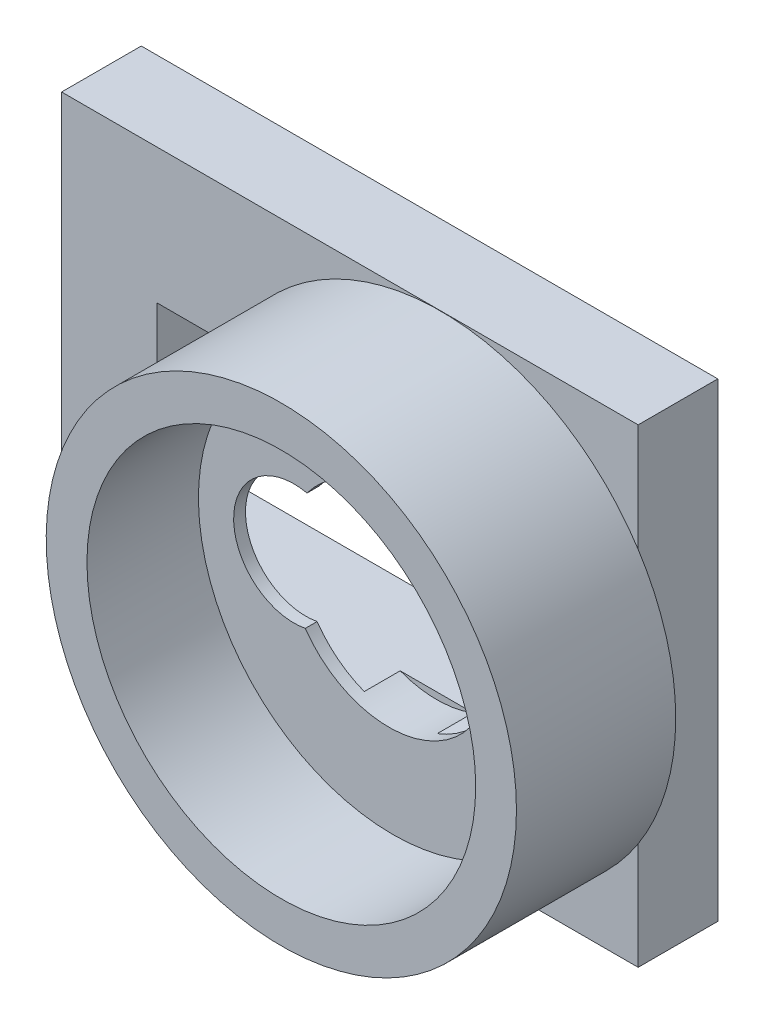
ISO-10303-21;
HEADER;
FILE_DESCRIPTION(('STEP AP214'),'2;1');
FILE_NAME('part.step','',(''),(''),'','','');
FILE_SCHEMA(('AUTOMOTIVE_DESIGN { 1 0 10303 214 1 1 1 1 }'));
ENDSEC;
DATA;
#1=APPLICATION_CONTEXT('core data for automotive mechanical design processes');
#2=APPLICATION_PROTOCOL_DEFINITION('international standard','automotive_design',2000,#1);
#3=PRODUCT_CONTEXT('',#1,'mechanical');
#4=PRODUCT('Part','Part','',(#3));
#5=PRODUCT_RELATED_PRODUCT_CATEGORY('part','',(#4));
#6=PRODUCT_DEFINITION_FORMATION('','',#4);
#7=PRODUCT_DEFINITION_CONTEXT('part definition',#1,'design');
#8=PRODUCT_DEFINITION('design','',#6,#7);
#9=PRODUCT_DEFINITION_SHAPE('','',#8);
#10=(LENGTH_UNIT() NAMED_UNIT(*) SI_UNIT(.MILLI.,.METRE.));
#11=(NAMED_UNIT(*) PLANE_ANGLE_UNIT() SI_UNIT($,.RADIAN.));
#12=(NAMED_UNIT(*) SI_UNIT($,.STERADIAN.) SOLID_ANGLE_UNIT());
#13=UNCERTAINTY_MEASURE_WITH_UNIT(LENGTH_MEASURE(1.E-05),#10,'distance_accuracy_value','');
#14=(GEOMETRIC_REPRESENTATION_CONTEXT(3) GLOBAL_UNCERTAINTY_ASSIGNED_CONTEXT((#13)) GLOBAL_UNIT_ASSIGNED_CONTEXT((#10,
#11,#12)) REPRESENTATION_CONTEXT('',''));
#15=CARTESIAN_POINT('',(0.,0.,0.));
#16=DIRECTION('',(0.,0.,1.));
#17=DIRECTION('',(1.,0.,0.));
#18=AXIS2_PLACEMENT_3D('',#15,#16,#17);
#19=CARTESIAN_POINT('',(0.,0.,5.));
#20=DIRECTION('',(0.,0.,1.));
#21=DIRECTION('',(1.,0.,0.));
#22=AXIS2_PLACEMENT_3D('',#19,#20,#21);
#23=PLANE('',#22);
#24=DIRECTION('',(1.,0.,0.));
#25=VECTOR('',#24,1.);
#26=CARTESIAN_POINT('',(21.0499987006187,-21.3449988514185,5.));
#27=LINE('',#26,#25);
#28=CARTESIAN_POINT('',(8.25926228249251,-21.3449988514185,4.99999988824129));
#29=VERTEX_POINT('',#28);
#30=CARTESIAN_POINT('',(12.8376101178694,-21.3449988514185,4.99999988824129));
#31=VERTEX_POINT('',#30);
#32=EDGE_CURVE('E302',#29,#31,#27,.T.);
#33=ORIENTED_EDGE('',*,*,#32,.F.);
#34=CARTESIAN_POINT('',(10.5484362001809,-15.3881239401325,5.));
#35=DIRECTION('',(0.,0.,1.));
#36=DIRECTION('',(1.,0.,0.));
#37=AXIS2_PLACEMENT_3D('',#34,#35,#36);
#38=CIRCLE('',#37,6.38158882521694);
#39=EDGE_CURVE('E252',#29,#31,#38,.T.);
#40=ORIENTED_EDGE('',*,*,#39,.T.);
#41=EDGE_LOOP('',(#33,#40));
#42=FACE_BOUND('',#41,.T.);
#43=ADVANCED_FACE('F41',(#42),#23,.T.);
#44=DIRECTION('',(0.,-1.,0.));
#45=VECTOR('',#44,1.);
#46=CARTESIAN_POINT('',(16.4916390715284,-8.97299963980913,5.));
#47=LINE('',#46,#45);
#48=CARTESIAN_POINT('',(16.4916390715284,-13.0636851768735,5.));
#49=VERTEX_POINT('',#48);
#50=CARTESIAN_POINT('',(16.4916390715284,-17.7125627033915,4.99999988824129));
#51=VERTEX_POINT('',#50);
#52=EDGE_CURVE('E289',#49,#51,#47,.T.);
#53=ORIENTED_EDGE('',*,*,#52,.T.);
#54=EDGE_CURVE('E249',#51,#49,#38,.T.);
#55=ORIENTED_EDGE('',*,*,#54,.T.);
#56=EDGE_LOOP('',(#53,#55));
#57=FACE_BOUND('',#56,.T.);
#58=ADVANCED_FACE('F390',(#57),#23,.T.);
#59=CARTESIAN_POINT('',(-7.00300000607967,-21.3449988514185,5.));
#60=VERTEX_POINT('',#59);
#61=CARTESIAN_POINT('',(-2.66384226985813,-21.3449988514185,4.99999988824129));
#62=VERTEX_POINT('',#61);
#63=EDGE_CURVE('E304',#60,#62,#27,.T.);
#64=ORIENTED_EDGE('',*,*,#63,.F.);
#65=DIRECTION('',(0.,1.,0.));
#66=VECTOR('',#65,1.);
#67=CARTESIAN_POINT('',(-7.00300000607967,-8.97299963980913,5.));
#68=LINE('',#67,#66);
#69=CARTESIAN_POINT('',(-7.00300000607967,-8.97299963980913,5.));
#70=VERTEX_POINT('',#69);
#71=EDGE_CURVE('E272',#60,#70,#68,.T.);
#72=ORIENTED_EDGE('',*,*,#71,.T.);
#73=DIRECTION('',(-1.,0.,0.));
#74=VECTOR('',#73,1.);
#75=CARTESIAN_POINT('',(21.0499987006187,-8.97299963980913,5.));
#76=LINE('',#75,#74);
#77=CARTESIAN_POINT('',(-2.55601900280958,-8.97299963980913,4.99999988824129));
#78=VERTEX_POINT('',#77);
#79=EDGE_CURVE('E300',#78,#70,#76,.T.);
#80=ORIENTED_EDGE('',*,*,#79,.F.);
#81=CARTESIAN_POINT('',(10.7946453661089,-15.275821527386,5.));
#82=DIRECTION('',(0.,0.,1.));
#83=DIRECTION('',(1.,0.,0.));
#84=AXIS2_PLACEMENT_3D('',#81,#82,#83);
#85=CIRCLE('',#84,14.7636649527828);
#86=CARTESIAN_POINT('',(23.2000015676022,-7.27126405354031,5.));
#87=VERTEX_POINT('',#86);
#88=EDGE_CURVE('E273',#87,#78,#85,.T.);
#89=ORIENTED_EDGE('',*,*,#88,.F.);
#90=DIRECTION('',(0.,1.,0.));
#91=VECTOR('',#90,1.);
#92=CARTESIAN_POINT('',(23.2000015676022,-0.500000023748725,5.));
#93=LINE('',#92,#91);
#94=CARTESIAN_POINT('',(23.2000015676022,-0.500000023748725,5.));
#95=VERTEX_POINT('',#94);
#96=EDGE_CURVE('E333',#87,#95,#93,.T.);
#97=ORIENTED_EDGE('',*,*,#96,.T.);
#98=DIRECTION('',(-1.,0.,0.));
#99=VECTOR('',#98,1.);
#100=CARTESIAN_POINT('',(-13.0000002682209,-0.500000023748725,5.));
#101=LINE('',#100,#99);
#102=CARTESIAN_POINT('',(-13.0000002682209,-0.500000023748725,5.));
#103=VERTEX_POINT('',#102);
#104=EDGE_CURVE('E338',#95,#103,#101,.T.);
#105=ORIENTED_EDGE('',*,*,#104,.T.);
#106=DIRECTION('',(0.,-1.,0.));
#107=VECTOR('',#106,1.);
#108=CARTESIAN_POINT('',(-13.0000002682209,-0.500000023748725,5.));
#109=LINE('',#108,#107);
#110=CARTESIAN_POINT('',(-13.0000002682209,-29.9999993294477,5.));
#111=VERTEX_POINT('',#110);
#112=EDGE_CURVE('E326',#103,#111,#109,.T.);
#113=ORIENTED_EDGE('',*,*,#112,.T.);
#114=DIRECTION('',(1.,0.,0.));
#115=VECTOR('',#114,1.);
#116=CARTESIAN_POINT('',(-13.0000002682209,-29.9999993294477,5.));
#117=LINE('',#116,#115);
#118=CARTESIAN_POINT('',(9.715575909911,-29.9999993294477,5.));
#119=VERTEX_POINT('',#118);
#120=EDGE_CURVE('E330',#111,#119,#117,.T.);
#121=ORIENTED_EDGE('',*,*,#120,.T.);
#122=EDGE_CURVE('E366',#62,#119,#85,.T.);
#123=ORIENTED_EDGE('',*,*,#122,.F.);
#124=EDGE_LOOP('',(#64,#72,#80,#89,#97,#105,#113,#121,#123));
#125=FACE_BOUND('',#124,.T.);
#126=ADVANCED_FACE('F392',(#125),#23,.T.);
#127=CARTESIAN_POINT('',(10.5484362001809,-15.3881239401325,5.));
#128=DIRECTION('',(0.,0.,1.));
#129=DIRECTION('',(1.,0.,0.));
#130=AXIS2_PLACEMENT_3D('',#127,#128,#129);
#131=CIRCLE('',#130,12.3981391852221);
#132=CARTESIAN_POINT('',(22.2653650239285,-19.4412010668812,5.));
#133=VERTEX_POINT('',#132);
#134=CARTESIAN_POINT('',(15.1689220287418,-3.88312650579079,5.));
#135=VERTEX_POINT('',#134);
#136=EDGE_CURVE('E255',#133,#135,#131,.T.);
#137=ORIENTED_EDGE('',*,*,#136,.F.);
#138=CARTESIAN_POINT('',(10.7946453661089,-15.275821527386,5.));
#139=DIRECTION('',(0.,0.,1.));
#140=DIRECTION('',(1.,0.,0.));
#141=AXIS2_PLACEMENT_3D('',#138,#139,#140);
#142=CIRCLE('',#141,12.2035976734869);
#143=EDGE_CURVE('E264',#133,#135,#142,.T.);
#144=ORIENTED_EDGE('',*,*,#143,.T.);
#145=EDGE_LOOP('',(#137,#144));
#146=FACE_BOUND('',#145,.T.);
#147=ADVANCED_FACE('F398',(#146),#23,.T.);
#148=CARTESIAN_POINT('',(-12.002999894321,-8.97299963980913,5.));
#149=DIRECTION('',(1.,0.,0.));
#150=DIRECTION('',(0.,0.,-1.));
#151=AXIS2_PLACEMENT_3D('',#148,#149,#150);
#152=PLANE('',#151);
#153=DIRECTION('',(0.,0.,-1.));
#154=VECTOR('',#153,1.);
#155=CARTESIAN_POINT('',(-12.002999894321,-8.97299963980913,5.));
#156=LINE('',#155,#154);
#157=CARTESIAN_POINT('',(-12.002999894321,-8.97299963980913,1.5));
#158=VERTEX_POINT('',#157);
#159=CARTESIAN_POINT('',(-12.002999894321,-8.97299963980913,0.));
#160=VERTEX_POINT('',#159);
#161=EDGE_CURVE('E321',#158,#160,#156,.T.);
#162=ORIENTED_EDGE('',*,*,#161,.F.);
#163=DIRECTION('',(0.,-1.,0.));
#164=VECTOR('',#163,1.);
#165=CARTESIAN_POINT('',(-12.002999894321,-8.97299963980913,1.5));
#166=LINE('',#165,#164);
#167=CARTESIAN_POINT('',(-12.002999894321,-21.3449988514185,1.5));
#168=VERTEX_POINT('',#167);
#169=EDGE_CURVE('E277',#158,#168,#166,.T.);
#170=ORIENTED_EDGE('',*,*,#169,.T.);
#171=DIRECTION('',(0.,0.,-1.));
#172=VECTOR('',#171,1.);
#173=CARTESIAN_POINT('',(-12.002999894321,-21.3449988514185,5.));
#174=LINE('',#173,#172);
#175=CARTESIAN_POINT('',(-12.002999894321,-21.3449988514185,0.));
#176=VERTEX_POINT('',#175);
#177=EDGE_CURVE('E319',#168,#176,#174,.T.);
#178=ORIENTED_EDGE('',*,*,#177,.T.);
#179=DIRECTION('',(0.,-1.,0.));
#180=VECTOR('',#179,1.);
#181=CARTESIAN_POINT('',(-12.002999894321,-8.97299963980913,0.));
#182=LINE('',#181,#180);
#183=EDGE_CURVE('E313',#160,#176,#182,.T.);
#184=ORIENTED_EDGE('',*,*,#183,.F.);
#185=EDGE_LOOP('',(#162,#170,#178,#184));
#186=FACE_BOUND('',#185,.T.);
#187=ADVANCED_FACE('F406',(#186),#152,.T.);
#188=CARTESIAN_POINT('',(11.8737148223067,-29.9999993294477,5.));
#189=VERTEX_POINT('',#188);
#190=CARTESIAN_POINT('',(23.2000015676022,-23.2803790012317,5.));
#191=VERTEX_POINT('',#190);
#192=EDGE_CURVE('E267',#189,#191,#85,.T.);
#193=ORIENTED_EDGE('',*,*,#192,.F.);
#194=CARTESIAN_POINT('',(23.2000015676022,-29.9999993294477,5.));
#195=VERTEX_POINT('',#194);
#196=EDGE_CURVE('E328',#189,#195,#117,.T.);
#197=ORIENTED_EDGE('',*,*,#196,.T.);
#198=EDGE_CURVE('E335',#195,#191,#93,.T.);
#199=ORIENTED_EDGE('',*,*,#198,.T.);
#200=EDGE_LOOP('',(#193,#197,#199));
#201=FACE_BOUND('',#200,.T.);
#202=ADVANCED_FACE('F401',(#201),#23,.T.);
#203=CARTESIAN_POINT('',(0.,0.,0.));
#204=DIRECTION('',(0.,0.,1.));
#205=DIRECTION('',(1.,0.,0.));
#206=AXIS2_PLACEMENT_3D('',#203,#204,#205);
#207=PLANE('',#206);
#208=DIRECTION('',(0.,-1.,0.));
#209=VECTOR('',#208,1.);
#210=CARTESIAN_POINT('',(-13.0000002682209,-0.500000023748725,0.));
#211=LINE('',#210,#209);
#212=CARTESIAN_POINT('',(-13.0000002682209,-0.500000023748725,0.));
#213=VERTEX_POINT('',#212);
#214=CARTESIAN_POINT('',(-13.0000002682209,-29.9999993294477,0.));
#215=VERTEX_POINT('',#214);
#216=EDGE_CURVE('E325',#213,#215,#211,.T.);
#217=ORIENTED_EDGE('',*,*,#216,.F.);
#218=DIRECTION('',(-1.,0.,0.));
#219=VECTOR('',#218,1.);
#220=CARTESIAN_POINT('',(-13.0000002682209,-0.500000023748725,0.));
#221=LINE('',#220,#219);
#222=CARTESIAN_POINT('',(23.2000015676022,-0.500000023748725,0.));
#223=VERTEX_POINT('',#222);
#224=EDGE_CURVE('E329',#223,#213,#221,.T.);
#225=ORIENTED_EDGE('',*,*,#224,.F.);
#226=DIRECTION('',(0.,1.,0.));
#227=VECTOR('',#226,1.);
#228=CARTESIAN_POINT('',(23.2000015676022,-0.500000023748725,0.));
#229=LINE('',#228,#227);
#230=CARTESIAN_POINT('',(23.2000015676022,-29.9999993294477,0.));
#231=VERTEX_POINT('',#230);
#232=EDGE_CURVE('E346',#231,#223,#229,.T.);
#233=ORIENTED_EDGE('',*,*,#232,.F.);
#234=DIRECTION('',(1.,0.,0.));
#235=VECTOR('',#234,1.);
#236=CARTESIAN_POINT('',(-13.0000002682209,-29.9999993294477,0.));
#237=LINE('',#236,#235);
#238=EDGE_CURVE('E344',#215,#231,#237,.T.);
#239=ORIENTED_EDGE('',*,*,#238,.F.);
#240=EDGE_LOOP('',(#217,#225,#233,#239));
#241=FACE_BOUND('',#240,.T.);
#242=DIRECTION('',(0.,1.,0.));
#243=VECTOR('',#242,1.);
#244=CARTESIAN_POINT('',(21.0499987006187,-8.97299963980913,0.));
#245=LINE('',#244,#243);
#246=CARTESIAN_POINT('',(21.0499987006187,-21.3449988514185,0.));
#247=VERTEX_POINT('',#246);
#248=CARTESIAN_POINT('',(21.0499987006187,-8.97299963980913,0.));
#249=VERTEX_POINT('',#248);
#250=EDGE_CURVE('E209',#247,#249,#245,.T.);
#251=ORIENTED_EDGE('',*,*,#250,.T.);
#252=DIRECTION('',(-1.,0.,0.));
#253=VECTOR('',#252,1.);
#254=CARTESIAN_POINT('',(21.0499987006187,-8.97299963980913,0.));
#255=LINE('',#254,#253);
#256=EDGE_CURVE('E310',#249,#160,#255,.T.);
#257=ORIENTED_EDGE('',*,*,#256,.T.);
#258=ORIENTED_EDGE('',*,*,#183,.T.);
#259=DIRECTION('',(1.,0.,0.));
#260=VECTOR('',#259,1.);
#261=CARTESIAN_POINT('',(21.0499987006187,-21.3449988514185,0.));
#262=LINE('',#261,#260);
#263=EDGE_CURVE('E303',#176,#247,#262,.T.);
#264=ORIENTED_EDGE('',*,*,#263,.T.);
#265=EDGE_LOOP('',(#251,#257,#258,#264));
#266=FACE_BOUND('',#265,.T.);
#267=ADVANCED_FACE('F405',(#241,#266),#207,.F.);
#268=CARTESIAN_POINT('',(-13.0000002682209,-0.500000023748725,5.));
#269=DIRECTION('',(1.,0.,0.));
#270=DIRECTION('',(0.,0.,-1.));
#271=AXIS2_PLACEMENT_3D('',#268,#269,#270);
#272=PLANE('',#271);
#273=ORIENTED_EDGE('',*,*,#216,.T.);
#274=DIRECTION('',(0.,0.,-1.));
#275=VECTOR('',#274,1.);
#276=CARTESIAN_POINT('',(-13.0000002682209,-29.9999993294477,5.));
#277=LINE('',#276,#275);
#278=EDGE_CURVE('E357',#111,#215,#277,.T.);
#279=ORIENTED_EDGE('',*,*,#278,.F.);
#280=ORIENTED_EDGE('',*,*,#112,.F.);
#281=DIRECTION('',(0.,0.,-1.));
#282=VECTOR('',#281,1.);
#283=CARTESIAN_POINT('',(-13.0000002682209,-0.500000023748725,5.));
#284=LINE('',#283,#282);
#285=EDGE_CURVE('E341',#103,#213,#284,.T.);
#286=ORIENTED_EDGE('',*,*,#285,.T.);
#287=EDGE_LOOP('',(#273,#279,#280,#286));
#288=FACE_BOUND('',#287,.T.);
#289=ADVANCED_FACE('F43',(#288),#272,.F.);
#290=CARTESIAN_POINT('',(-13.0000002682209,-29.9999993294477,5.));
#291=DIRECTION('',(0.,1.,0.));
#292=DIRECTION('',(0.,0.,1.));
#293=AXIS2_PLACEMENT_3D('',#290,#291,#292);
#294=PLANE('',#293);
#295=ORIENTED_EDGE('',*,*,#238,.T.);
#296=DIRECTION('',(0.,0.,-1.));
#297=VECTOR('',#296,1.);
#298=CARTESIAN_POINT('',(23.2000015676022,-29.9999993294477,5.));
#299=LINE('',#298,#297);
#300=EDGE_CURVE('E354',#195,#231,#299,.T.);
#301=ORIENTED_EDGE('',*,*,#300,.F.);
#302=ORIENTED_EDGE('',*,*,#196,.F.);
#303=EDGE_CURVE('E334',#119,#189,#117,.T.);
#304=ORIENTED_EDGE('',*,*,#303,.F.);
#305=ORIENTED_EDGE('',*,*,#120,.F.);
#306=ORIENTED_EDGE('',*,*,#278,.T.);
#307=EDGE_LOOP('',(#295,#301,#302,#304,#305,#306));
#308=FACE_BOUND('',#307,.T.);
#309=ADVANCED_FACE('F419',(#308),#294,.F.);
#310=CARTESIAN_POINT('',(23.2000015676022,-0.500000023748725,5.));
#311=DIRECTION('',(-1.,0.,0.));
#312=DIRECTION('',(0.,0.,1.));
#313=AXIS2_PLACEMENT_3D('',#310,#311,#312);
#314=PLANE('',#313);
#315=ORIENTED_EDGE('',*,*,#232,.T.);
#316=DIRECTION('',(0.,0.,-1.));
#317=VECTOR('',#316,1.);
#318=CARTESIAN_POINT('',(23.2000015676022,-0.500000023748725,5.));
#319=LINE('',#318,#317);
#320=EDGE_CURVE('E351',#95,#223,#319,.T.);
#321=ORIENTED_EDGE('',*,*,#320,.F.);
#322=ORIENTED_EDGE('',*,*,#96,.F.);
#323=EDGE_CURVE('E339',#191,#87,#93,.T.);
#324=ORIENTED_EDGE('',*,*,#323,.F.);
#325=ORIENTED_EDGE('',*,*,#198,.F.);
#326=ORIENTED_EDGE('',*,*,#300,.T.);
#327=EDGE_LOOP('',(#315,#321,#322,#324,#325,#326));
#328=FACE_BOUND('',#327,.T.);
#329=ADVANCED_FACE('F416',(#328),#314,.F.);
#330=CARTESIAN_POINT('',(-13.0000002682209,-0.500000023748725,5.));
#331=DIRECTION('',(0.,-1.,0.));
#332=DIRECTION('',(0.,0.,-1.));
#333=AXIS2_PLACEMENT_3D('',#330,#331,#332);
#334=PLANE('',#333);
#335=ORIENTED_EDGE('',*,*,#224,.T.);
#336=ORIENTED_EDGE('',*,*,#285,.F.);
#337=ORIENTED_EDGE('',*,*,#104,.F.);
#338=ORIENTED_EDGE('',*,*,#320,.T.);
#339=EDGE_LOOP('',(#335,#336,#337,#338));
#340=FACE_BOUND('',#339,.T.);
#341=ADVANCED_FACE('F413',(#340),#334,.F.);
#342=CARTESIAN_POINT('',(21.0499987006187,-8.97299963980913,5.));
#343=DIRECTION('',(-1.,0.,0.));
#344=DIRECTION('',(0.,0.,1.));
#345=AXIS2_PLACEMENT_3D('',#342,#343,#344);
#346=PLANE('',#345);
#347=DIRECTION('',(0.,1.,0.));
#348=VECTOR('',#347,1.);
#349=CARTESIAN_POINT('',(21.0499987006187,-8.97299963980913,1.5));
#350=LINE('',#349,#348);
#351=CARTESIAN_POINT('',(21.0499987006187,-21.3449988514185,1.5));
#352=VERTEX_POINT('',#351);
#353=CARTESIAN_POINT('',(21.0499987006187,-8.97299963980913,1.5));
#354=VERTEX_POINT('',#353);
#355=EDGE_CURVE('E290',#352,#354,#350,.T.);
#356=ORIENTED_EDGE('',*,*,#355,.T.);
#357=DIRECTION('',(0.,0.,-1.));
#358=VECTOR('',#357,1.);
#359=CARTESIAN_POINT('',(21.0499987006187,-8.97299963980913,5.));
#360=LINE('',#359,#358);
#361=EDGE_CURVE('E323',#354,#249,#360,.T.);
#362=ORIENTED_EDGE('',*,*,#361,.T.);
#363=ORIENTED_EDGE('',*,*,#250,.F.);
#364=DIRECTION('',(0.,0.,-1.));
#365=VECTOR('',#364,1.);
#366=CARTESIAN_POINT('',(21.0499987006187,-21.3449988514185,5.));
#367=LINE('',#366,#365);
#368=EDGE_CURVE('E307',#352,#247,#367,.T.);
#369=ORIENTED_EDGE('',*,*,#368,.F.);
#370=EDGE_LOOP('',(#356,#362,#363,#369));
#371=FACE_BOUND('',#370,.T.);
#372=ADVANCED_FACE('F408',(#371),#346,.T.);
#373=CARTESIAN_POINT('',(21.0499987006187,-8.97299963980913,5.));
#374=DIRECTION('',(0.,-1.,0.));
#375=DIRECTION('',(0.,0.,-1.));
#376=AXIS2_PLACEMENT_3D('',#373,#374,#375);
#377=PLANE('',#376);
#378=DIRECTION('',(0.,0.,1.));
#379=VECTOR('',#378,1.);
#380=CARTESIAN_POINT('',(-7.00300000607967,-8.97299963980913,1.5));
#381=LINE('',#380,#379);
#382=CARTESIAN_POINT('',(-7.00300000607967,-8.97299963980913,1.5));
#383=VERTEX_POINT('',#382);
#384=EDGE_CURVE('E284',#383,#70,#381,.T.);
#385=ORIENTED_EDGE('',*,*,#384,.F.);
#386=DIRECTION('',(-1.,0.,0.));
#387=VECTOR('',#386,1.);
#388=CARTESIAN_POINT('',(-12.002999894321,-8.97299963980913,1.5));
#389=LINE('',#388,#387);
#390=EDGE_CURVE('E282',#383,#158,#389,.T.);
#391=ORIENTED_EDGE('',*,*,#390,.T.);
#392=ORIENTED_EDGE('',*,*,#161,.T.);
#393=ORIENTED_EDGE('',*,*,#256,.F.);
#394=ORIENTED_EDGE('',*,*,#361,.F.);
#395=DIRECTION('',(-1.,0.,0.));
#396=VECTOR('',#395,1.);
#397=CARTESIAN_POINT('',(21.0499987006187,-8.97299963980913,1.5));
#398=LINE('',#397,#396);
#399=CARTESIAN_POINT('',(16.4916390715284,-8.97299963980913,1.5));
#400=VERTEX_POINT('',#399);
#401=EDGE_CURVE('E292',#354,#400,#398,.T.);
#402=ORIENTED_EDGE('',*,*,#401,.T.);
#403=DIRECTION('',(0.,0.,1.));
#404=VECTOR('',#403,1.);
#405=CARTESIAN_POINT('',(16.4916390715284,-8.97299963980913,1.5));
#406=LINE('',#405,#404);
#407=CARTESIAN_POINT('',(16.4916390715284,-8.97299963980913,7.25651338028399));
#408=VERTEX_POINT('',#407);
#409=EDGE_CURVE('E210',#400,#408,#406,.T.);
#410=ORIENTED_EDGE('',*,*,#409,.T.);
#411=DIRECTION('',(-1.,0.,0.));
#412=VECTOR('',#411,1.);
#413=CARTESIAN_POINT('',(29.0677361462107,-8.97299963980913,7.25651338028399));
#414=LINE('',#413,#412);
#415=CARTESIAN_POINT('',(-2.55601900280959,-8.97299963980913,7.25651338028399));
#416=VERTEX_POINT('',#415);
#417=EDGE_CURVE('E220',#408,#416,#414,.T.);
#418=ORIENTED_EDGE('',*,*,#417,.T.);
#419=DIRECTION('',(0.,0.,-1.));
#420=VECTOR('',#419,1.);
#421=CARTESIAN_POINT('',(-2.55601900280959,-8.97299963980913,15.));
#422=LINE('',#421,#420);
#423=EDGE_CURVE('E11',#78,#416,#422,.F.);
#424=ORIENTED_EDGE('',*,*,#423,.F.);
#425=ORIENTED_EDGE('',*,*,#79,.T.);
#426=EDGE_LOOP('',(#385,#391,#392,#393,#394,#402,#410,#418,#424,#425));
#427=FACE_BOUND('',#426,.T.);
#428=ADVANCED_FACE('F488',(#427),#377,.T.);
#429=CARTESIAN_POINT('',(21.0499987006187,-21.3449988514185,5.));
#430=DIRECTION('',(0.,1.,0.));
#431=DIRECTION('',(0.,0.,1.));
#432=AXIS2_PLACEMENT_3D('',#429,#430,#431);
#433=PLANE('',#432);
#434=DIRECTION('',(0.,0.,-1.));
#435=VECTOR('',#434,1.);
#436=CARTESIAN_POINT('',(-7.00300000607967,-21.3449988514185,5.));
#437=LINE('',#436,#435);
#438=CARTESIAN_POINT('',(-7.00300000607967,-21.3449988514185,1.5));
#439=VERTEX_POINT('',#438);
#440=EDGE_CURVE('E268',#60,#439,#437,.T.);
#441=ORIENTED_EDGE('',*,*,#440,.F.);
#442=ORIENTED_EDGE('',*,*,#63,.T.);
#443=DIRECTION('',(0.,0.,-1.));
#444=VECTOR('',#443,1.);
#445=CARTESIAN_POINT('',(-2.66384226985814,-21.3449988514185,15.));
#446=LINE('',#445,#444);
#447=CARTESIAN_POINT('',(-2.66384226985813,-21.3449988514185,7.25651338028399));
#448=VERTEX_POINT('',#447);
#449=EDGE_CURVE('E232',#448,#62,#446,.T.);
#450=ORIENTED_EDGE('',*,*,#449,.F.);
#451=DIRECTION('',(-1.,0.,0.));
#452=VECTOR('',#451,1.);
#453=CARTESIAN_POINT('',(29.0677361462107,-21.3449988514185,7.25651338028399));
#454=LINE('',#453,#452);
#455=CARTESIAN_POINT('',(8.25926228249251,-21.3449988514185,7.25651338028399));
#456=VERTEX_POINT('',#455);
#457=EDGE_CURVE('E226',#456,#448,#454,.T.);
#458=ORIENTED_EDGE('',*,*,#457,.F.);
#459=DIRECTION('',(0.,0.,1.));
#460=VECTOR('',#459,1.);
#461=CARTESIAN_POINT('',(8.2592622824925,-21.3449988514185,5.));
#462=LINE('',#461,#460);
#463=EDGE_CURVE('E378',#29,#456,#462,.T.);
#464=ORIENTED_EDGE('',*,*,#463,.F.);
#465=ORIENTED_EDGE('',*,*,#32,.T.);
#466=DIRECTION('',(0.,0.,1.));
#467=VECTOR('',#466,1.);
#468=CARTESIAN_POINT('',(12.8376101178694,-21.3449988514185,5.));
#469=LINE('',#468,#467);
#470=CARTESIAN_POINT('',(12.8376101178694,-21.3449988514185,7.25651338028399));
#471=VERTEX_POINT('',#470);
#472=EDGE_CURVE('E225',#471,#31,#469,.F.);
#473=ORIENTED_EDGE('',*,*,#472,.F.);
#474=CARTESIAN_POINT('',(16.4916390715284,-21.3449988514185,7.25651338028399));
#475=VERTEX_POINT('',#474);
#476=EDGE_CURVE('E215',#475,#471,#454,.T.);
#477=ORIENTED_EDGE('',*,*,#476,.F.);
#478=DIRECTION('',(0.,0.,1.));
#479=VECTOR('',#478,1.);
#480=CARTESIAN_POINT('',(16.4916390715284,-21.3449988514185,1.5));
#481=LINE('',#480,#479);
#482=CARTESIAN_POINT('',(16.4916390715284,-21.3449988514185,1.5));
#483=VERTEX_POINT('',#482);
#484=EDGE_CURVE('E200',#483,#475,#481,.T.);
#485=ORIENTED_EDGE('',*,*,#484,.F.);
#486=DIRECTION('',(1.,0.,0.));
#487=VECTOR('',#486,1.);
#488=CARTESIAN_POINT('',(21.0499987006187,-21.3449988514185,1.5));
#489=LINE('',#488,#487);
#490=EDGE_CURVE('E295',#483,#352,#489,.T.);
#491=ORIENTED_EDGE('',*,*,#490,.T.);
#492=ORIENTED_EDGE('',*,*,#368,.T.);
#493=ORIENTED_EDGE('',*,*,#263,.F.);
#494=ORIENTED_EDGE('',*,*,#177,.F.);
#495=DIRECTION('',(1.,0.,0.));
#496=VECTOR('',#495,1.);
#497=CARTESIAN_POINT('',(21.0499987006187,-21.3449988514185,1.5));
#498=LINE('',#497,#496);
#499=EDGE_CURVE('E360',#168,#439,#498,.T.);
#500=ORIENTED_EDGE('',*,*,#499,.T.);
#501=EDGE_LOOP('',(#441,#442,#450,#458,#464,#465,#473,#477,#485,#491,#492,#493,#494,#500));
#502=FACE_BOUND('',#501,.T.);
#503=ADVANCED_FACE('F223',(#502),#433,.T.);
#504=CARTESIAN_POINT('',(16.4916390715284,-8.97299963980913,1.5));
#505=DIRECTION('',(-1.,0.,0.));
#506=DIRECTION('',(0.,0.,1.));
#507=AXIS2_PLACEMENT_3D('',#504,#505,#506);
#508=PLANE('',#507);
#509=ORIENTED_EDGE('',*,*,#52,.F.);
#510=DIRECTION('',(0.,0.,1.));
#511=VECTOR('',#510,1.);
#512=CARTESIAN_POINT('',(16.4916390715284,-13.0636851768735,5.));
#513=LINE('',#512,#511);
#514=CARTESIAN_POINT('',(16.4916390715284,-13.0636851768735,7.25651338028399));
#515=VERTEX_POINT('',#514);
#516=EDGE_CURVE('E371',#49,#515,#513,.T.);
#517=ORIENTED_EDGE('',*,*,#516,.T.);
#518=DIRECTION('',(0.,-1.,0.));
#519=VECTOR('',#518,1.);
#520=CARTESIAN_POINT('',(16.4916390715284,-8.97299963980913,7.25651338028399));
#521=LINE('',#520,#519);
#522=EDGE_CURVE('E219',#408,#515,#521,.T.);
#523=ORIENTED_EDGE('',*,*,#522,.F.);
#524=ORIENTED_EDGE('',*,*,#409,.F.);
#525=DIRECTION('',(0.,-1.,0.));
#526=VECTOR('',#525,1.);
#527=CARTESIAN_POINT('',(16.4916390715284,-8.97299963980913,1.5));
#528=LINE('',#527,#526);
#529=EDGE_CURVE('E205',#400,#483,#528,.T.);
#530=ORIENTED_EDGE('',*,*,#529,.T.);
#531=ORIENTED_EDGE('',*,*,#484,.T.);
#532=CARTESIAN_POINT('',(16.4916390715284,-17.7125627033915,7.25651338028399));
#533=VERTEX_POINT('',#532);
#534=EDGE_CURVE('E56',#533,#475,#521,.T.);
#535=ORIENTED_EDGE('',*,*,#534,.F.);
#536=DIRECTION('',(0.,0.,1.));
#537=VECTOR('',#536,1.);
#538=CARTESIAN_POINT('',(16.4916390715284,-17.7125627033915,5.));
#539=LINE('',#538,#537);
#540=EDGE_CURVE('E376',#533,#51,#539,.F.);
#541=ORIENTED_EDGE('',*,*,#540,.T.);
#542=EDGE_LOOP('',(#509,#517,#523,#524,#530,#531,#535,#541));
#543=FACE_BOUND('',#542,.T.);
#544=ADVANCED_FACE('F202',(#543),#508,.T.);
#545=CARTESIAN_POINT('',(0.,0.,1.5));
#546=DIRECTION('',(0.,0.,-1.));
#547=DIRECTION('',(-1.,0.,0.));
#548=AXIS2_PLACEMENT_3D('',#545,#546,#547);
#549=PLANE('',#548);
#550=ORIENTED_EDGE('',*,*,#355,.F.);
#551=ORIENTED_EDGE('',*,*,#490,.F.);
#552=ORIENTED_EDGE('',*,*,#529,.F.);
#553=ORIENTED_EDGE('',*,*,#401,.F.);
#554=EDGE_LOOP('',(#550,#551,#552,#553));
#555=FACE_BOUND('',#554,.T.);
#556=ADVANCED_FACE('F479',(#555),#549,.T.);
#557=CARTESIAN_POINT('',(-7.00300000607967,-8.97299963980913,1.5));
#558=DIRECTION('',(1.,0.,0.));
#559=DIRECTION('',(0.,0.,-1.));
#560=AXIS2_PLACEMENT_3D('',#557,#558,#559);
#561=PLANE('',#560);
#562=ORIENTED_EDGE('',*,*,#71,.F.);
#563=ORIENTED_EDGE('',*,*,#440,.T.);
#564=DIRECTION('',(0.,1.,0.));
#565=VECTOR('',#564,1.);
#566=CARTESIAN_POINT('',(-7.00300000607967,-8.97299963980913,1.5));
#567=LINE('',#566,#565);
#568=EDGE_CURVE('E279',#439,#383,#567,.T.);
#569=ORIENTED_EDGE('',*,*,#568,.T.);
#570=ORIENTED_EDGE('',*,*,#384,.T.);
#571=EDGE_LOOP('',(#562,#563,#569,#570));
#572=FACE_BOUND('',#571,.T.);
#573=ADVANCED_FACE('F475',(#572),#561,.T.);
#574=CARTESIAN_POINT('',(0.,0.,1.5));
#575=DIRECTION('',(0.,0.,1.));
#576=DIRECTION('',(1.,0.,0.));
#577=AXIS2_PLACEMENT_3D('',#574,#575,#576);
#578=PLANE('',#577);
#579=ORIENTED_EDGE('',*,*,#499,.F.);
#580=ORIENTED_EDGE('',*,*,#169,.F.);
#581=ORIENTED_EDGE('',*,*,#390,.F.);
#582=ORIENTED_EDGE('',*,*,#568,.F.);
#583=EDGE_LOOP('',(#579,#580,#581,#582));
#584=FACE_BOUND('',#583,.T.);
#585=ADVANCED_FACE('F466',(#584),#578,.F.);
#586=CARTESIAN_POINT('',(10.7946453661089,-15.275821527386,5.));
#587=DIRECTION('',(0.,0.,1.));
#588=DIRECTION('',(1.,0.,0.));
#589=AXIS2_PLACEMENT_3D('',#586,#587,#588);
#590=PLANE('',#589);
#591=EDGE_CURVE('E276',#119,#189,#85,.T.);
#592=ORIENTED_EDGE('',*,*,#591,.F.);
#593=ORIENTED_EDGE('',*,*,#303,.T.);
#594=EDGE_LOOP('',(#592,#593));
#595=FACE_BOUND('',#594,.T.);
#596=ADVANCED_FACE('F458',(#595),#590,.F.);
#597=EDGE_CURVE('E263',#191,#87,#85,.T.);
#598=ORIENTED_EDGE('',*,*,#597,.F.);
#599=ORIENTED_EDGE('',*,*,#323,.T.);
#600=EDGE_LOOP('',(#598,#599));
#601=FACE_BOUND('',#600,.T.);
#602=ADVANCED_FACE('F455',(#601),#590,.F.);
#603=CARTESIAN_POINT('',(10.7946453661089,-15.275821527386,15.));
#604=DIRECTION('',(0.,0.,1.));
#605=DIRECTION('',(1.,0.,0.));
#606=AXIS2_PLACEMENT_3D('',#603,#604,#605);
#607=PLANE('',#606);
#608=CARTESIAN_POINT('',(10.7946453661089,-15.275821527386,15.));
#609=DIRECTION('',(0.,0.,1.));
#610=DIRECTION('',(1.,0.,0.));
#611=AXIS2_PLACEMENT_3D('',#608,#609,#610);
#612=CIRCLE('',#611,14.7636649527828);
#613=CARTESIAN_POINT('',(25.5583103188917,-15.275821527386,15.));
#614=VERTEX_POINT('',#613);
#615=EDGE_CURVE('E269',#614,#614,#612,.T.);
#616=ORIENTED_EDGE('',*,*,#615,.T.);
#617=EDGE_LOOP('',(#616));
#618=FACE_BOUND('',#617,.T.);
#619=CARTESIAN_POINT('',(10.7946453661089,-15.275821527386,15.));
#620=DIRECTION('',(0.,0.,1.));
#621=DIRECTION('',(1.,0.,0.));
#622=AXIS2_PLACEMENT_3D('',#619,#620,#621);
#623=CIRCLE('',#622,12.2035976734869);
#624=CARTESIAN_POINT('',(22.9982430395958,-15.275821527386,15.));
#625=VERTEX_POINT('',#624);
#626=EDGE_CURVE('E260',#625,#625,#623,.T.);
#627=ORIENTED_EDGE('',*,*,#626,.F.);
#628=EDGE_LOOP('',(#627));
#629=FACE_BOUND('',#628,.T.);
#630=ADVANCED_FACE('F457',(#618,#629),#607,.T.);
#631=CARTESIAN_POINT('',(10.7946453661089,-15.275821527386,15.));
#632=DIRECTION('',(0.,0.,-1.));
#633=DIRECTION('',(-1.,0.,0.));
#634=AXIS2_PLACEMENT_3D('',#631,#632,#633);
#635=CYLINDRICAL_SURFACE('',#634,14.7636649527828);
#636=ORIENTED_EDGE('',*,*,#615,.F.);
#637=EDGE_LOOP('',(#636));
#638=FACE_BOUND('',#637,.T.);
#639=ORIENTED_EDGE('',*,*,#88,.T.);
#640=ORIENTED_EDGE('',*,*,#423,.T.);
#641=CARTESIAN_POINT('',(10.7946453661089,-15.275821527386,7.25651338028399));
#642=DIRECTION('',(0.,0.,1.));
#643=DIRECTION('',(0.,-1.,0.));
#644=AXIS2_PLACEMENT_3D('',#641,#642,#643);
#645=CIRCLE('',#644,14.7636649527828);
#646=EDGE_CURVE('E237',#416,#448,#645,.T.);
#647=ORIENTED_EDGE('',*,*,#646,.T.);
#648=ORIENTED_EDGE('',*,*,#449,.T.);
#649=ORIENTED_EDGE('',*,*,#122,.T.);
#650=ORIENTED_EDGE('',*,*,#591,.T.);
#651=ORIENTED_EDGE('',*,*,#192,.T.);
#652=ORIENTED_EDGE('',*,*,#597,.T.);
#653=EDGE_LOOP('',(#639,#640,#647,#648,#649,#650,#651,#652));
#654=FACE_BOUND('',#653,.T.);
#655=ADVANCED_FACE('F451',(#638,#654),#635,.T.);
#656=CARTESIAN_POINT('',(10.7946453661089,-15.275821527386,15.));
#657=DIRECTION('',(0.,0.,-1.));
#658=DIRECTION('',(-1.,0.,0.));
#659=AXIS2_PLACEMENT_3D('',#656,#657,#658);
#660=CYLINDRICAL_SURFACE('',#659,12.2035976734869);
#661=DIRECTION('',(0.,0.,1.));
#662=VECTOR('',#661,1.);
#663=CARTESIAN_POINT('',(15.1689220287418,-3.88312650579079,6.5));
#664=LINE('',#663,#662);
#665=CARTESIAN_POINT('',(15.1689220287418,-3.88312650579079,8.));
#666=VERTEX_POINT('',#665);
#667=EDGE_CURVE('E369',#135,#666,#664,.T.);
#668=ORIENTED_EDGE('',*,*,#667,.F.);
#669=ORIENTED_EDGE('',*,*,#143,.F.);
#670=DIRECTION('',(0.,0.,1.));
#671=VECTOR('',#670,1.);
#672=CARTESIAN_POINT('',(22.2653650239285,-19.4412010668812,6.5));
#673=LINE('',#672,#671);
#674=CARTESIAN_POINT('',(22.2653650239285,-19.4412010668812,8.));
#675=VERTEX_POINT('',#674);
#676=EDGE_CURVE('E365',#675,#133,#673,.F.);
#677=ORIENTED_EDGE('',*,*,#676,.F.);
#678=CARTESIAN_POINT('',(10.7946453661089,-15.275821527386,8.));
#679=DIRECTION('',(0.,0.,1.));
#680=DIRECTION('',(1.,0.,0.));
#681=AXIS2_PLACEMENT_3D('',#678,#679,#680);
#682=CIRCLE('',#681,12.2035976734869);
#683=EDGE_CURVE('E64',#666,#675,#682,.T.);
#684=ORIENTED_EDGE('',*,*,#683,.F.);
#685=EDGE_LOOP('',(#668,#669,#677,#684));
#686=FACE_BOUND('',#685,.T.);
#687=ORIENTED_EDGE('',*,*,#626,.T.);
#688=EDGE_LOOP('',(#687));
#689=FACE_BOUND('',#688,.T.);
#690=ADVANCED_FACE('F471',(#686,#689),#660,.F.);
#691=CARTESIAN_POINT('',(10.5484362001809,-15.3881239401325,8.));
#692=DIRECTION('',(0.,0.,1.));
#693=DIRECTION('',(1.,0.,0.));
#694=AXIS2_PLACEMENT_3D('',#691,#692,#693);
#695=PLANE('',#694);
#696=CARTESIAN_POINT('',(10.5484362001809,-15.3881239401325,8.));
#697=DIRECTION('',(0.,0.,1.));
#698=DIRECTION('',(1.,0.,0.));
#699=AXIS2_PLACEMENT_3D('',#696,#697,#698);
#700=CIRCLE('',#699,6.38158882521694);
#701=CARTESIAN_POINT('',(5.29921605781776,-19.0172235297198,8.));
#702=VERTEX_POINT('',#701);
#703=CARTESIAN_POINT('',(5.40874854801351,-11.6054943293602,8.));
#704=VERTEX_POINT('',#703);
#705=EDGE_CURVE('E243',#702,#704,#700,.T.);
#706=ORIENTED_EDGE('',*,*,#705,.F.);
#707=CARTESIAN_POINT('',(4.58533255899476,-15.2999996207654,8.));
#708=DIRECTION('',(0.,0.,1.));
#709=DIRECTION('',(1.,0.,0.));
#710=AXIS2_PLACEMENT_3D('',#707,#708,#709);
#711=CIRCLE('',#710,3.78515300076408);
#712=EDGE_CURVE('E240',#704,#702,#711,.T.);
#713=ORIENTED_EDGE('',*,*,#712,.F.);
#714=EDGE_LOOP('',(#706,#713));
#715=FACE_BOUND('',#714,.T.);
#716=CARTESIAN_POINT('',(10.5484362001809,-15.3881239401325,8.));
#717=DIRECTION('',(0.,0.,1.));
#718=DIRECTION('',(1.,0.,0.));
#719=AXIS2_PLACEMENT_3D('',#716,#717,#718);
#720=CIRCLE('',#719,12.3981391852221);
#721=EDGE_CURVE('E246',#675,#666,#720,.T.);
#722=ORIENTED_EDGE('',*,*,#721,.T.);
#723=ORIENTED_EDGE('',*,*,#683,.T.);
#724=EDGE_LOOP('',(#722,#723));
#725=FACE_BOUND('',#724,.T.);
#726=ADVANCED_FACE('F522',(#715,#725),#695,.T.);
#727=CARTESIAN_POINT('',(10.5484362001809,-15.3881239401325,5.));
#728=DIRECTION('',(0.,0.,1.));
#729=DIRECTION('',(1.,0.,0.));
#730=AXIS2_PLACEMENT_3D('',#727,#728,#729);
#731=CYLINDRICAL_SURFACE('',#730,12.3981391852221);
#732=ORIENTED_EDGE('',*,*,#136,.T.);
#733=ORIENTED_EDGE('',*,*,#667,.T.);
#734=ORIENTED_EDGE('',*,*,#721,.F.);
#735=ORIENTED_EDGE('',*,*,#676,.T.);
#736=EDGE_LOOP('',(#732,#733,#734,#735));
#737=FACE_BOUND('',#736,.T.);
#738=ADVANCED_FACE('F525',(#737),#731,.T.);
#739=CARTESIAN_POINT('',(4.58533255899476,-15.2999996207654,5.));
#740=DIRECTION('',(0.,0.,1.));
#741=DIRECTION('',(1.,0.,0.));
#742=AXIS2_PLACEMENT_3D('',#739,#740,#741);
#743=CYLINDRICAL_SURFACE('',#742,3.78515300076408);
#744=DIRECTION('',(0.,0.,1.));
#745=VECTOR('',#744,1.);
#746=CARTESIAN_POINT('',(5.29921605781776,-19.0172235297198,5.));
#747=LINE('',#746,#745);
#748=CARTESIAN_POINT('',(5.29921605781776,-19.0172235297198,7.25651338028399));
#749=VERTEX_POINT('',#748);
#750=EDGE_CURVE('E256',#749,#702,#747,.T.);
#751=ORIENTED_EDGE('',*,*,#750,.F.);
#752=CARTESIAN_POINT('',(4.58533255899476,-15.2999996207654,7.25651338028399));
#753=DIRECTION('',(0.,0.,1.));
#754=DIRECTION('',(0.,-1.,0.));
#755=AXIS2_PLACEMENT_3D('',#752,#753,#754);
#756=CIRCLE('',#755,3.78515300076408);
#757=CARTESIAN_POINT('',(5.40874854801351,-11.6054943293602,7.25651338028399));
#758=VERTEX_POINT('',#757);
#759=EDGE_CURVE('E234',#749,#758,#756,.F.);
#760=ORIENTED_EDGE('',*,*,#759,.T.);
#761=DIRECTION('',(0.,0.,1.));
#762=VECTOR('',#761,1.);
#763=CARTESIAN_POINT('',(5.40874854801351,-11.6054943293602,5.));
#764=LINE('',#763,#762);
#765=EDGE_CURVE('E253',#758,#704,#764,.T.);
#766=ORIENTED_EDGE('',*,*,#765,.T.);
#767=ORIENTED_EDGE('',*,*,#712,.T.);
#768=EDGE_LOOP('',(#751,#760,#766,#767));
#769=FACE_BOUND('',#768,.T.);
#770=ADVANCED_FACE('F518',(#769),#743,.F.);
#771=CARTESIAN_POINT('',(10.5484362001809,-15.3881239401325,5.));
#772=DIRECTION('',(0.,0.,1.));
#773=DIRECTION('',(1.,0.,0.));
#774=AXIS2_PLACEMENT_3D('',#771,#772,#773);
#775=CYLINDRICAL_SURFACE('',#774,6.38158882521694);
#776=ORIENTED_EDGE('',*,*,#463,.T.);
#777=CARTESIAN_POINT('',(10.5484362001809,-15.3881239401325,7.25651338028399));
#778=DIRECTION('',(0.,0.,1.));
#779=DIRECTION('',(0.,-1.,0.));
#780=AXIS2_PLACEMENT_3D('',#777,#778,#779);
#781=CIRCLE('',#780,6.38158882521694);
#782=EDGE_CURVE('E49',#456,#749,#781,.F.);
#783=ORIENTED_EDGE('',*,*,#782,.T.);
#784=ORIENTED_EDGE('',*,*,#750,.T.);
#785=ORIENTED_EDGE('',*,*,#705,.T.);
#786=ORIENTED_EDGE('',*,*,#765,.F.);
#787=EDGE_CURVE('E373',#758,#515,#781,.F.);
#788=ORIENTED_EDGE('',*,*,#787,.T.);
#789=ORIENTED_EDGE('',*,*,#516,.F.);
#790=ORIENTED_EDGE('',*,*,#54,.F.);
#791=ORIENTED_EDGE('',*,*,#540,.F.);
#792=EDGE_CURVE('E217',#533,#471,#781,.F.);
#793=ORIENTED_EDGE('',*,*,#792,.T.);
#794=ORIENTED_EDGE('',*,*,#472,.T.);
#795=ORIENTED_EDGE('',*,*,#39,.F.);
#796=EDGE_LOOP('',(#776,#783,#784,#785,#786,#788,#789,#790,#791,#793,#794,#795));
#797=FACE_BOUND('',#796,.T.);
#798=ADVANCED_FACE('F384',(#797),#775,.F.);
#799=CARTESIAN_POINT('',(29.0677361462107,-8.97299963980913,7.25651338028399));
#800=DIRECTION('',(0.,0.,1.));
#801=DIRECTION('',(0.,-1.,0.));
#802=AXIS2_PLACEMENT_3D('',#799,#800,#801);
#803=PLANE('',#802);
#804=ORIENTED_EDGE('',*,*,#417,.F.);
#805=ORIENTED_EDGE('',*,*,#522,.T.);
#806=ORIENTED_EDGE('',*,*,#787,.F.);
#807=ORIENTED_EDGE('',*,*,#759,.F.);
#808=ORIENTED_EDGE('',*,*,#782,.F.);
#809=ORIENTED_EDGE('',*,*,#457,.T.);
#810=ORIENTED_EDGE('',*,*,#646,.F.);
#811=EDGE_LOOP('',(#804,#805,#806,#807,#808,#809,#810));
#812=FACE_BOUND('',#811,.T.);
#813=ADVANCED_FACE('F514',(#812),#803,.F.);
#814=ORIENTED_EDGE('',*,*,#534,.T.);
#815=ORIENTED_EDGE('',*,*,#476,.T.);
#816=ORIENTED_EDGE('',*,*,#792,.F.);
#817=EDGE_LOOP('',(#814,#815,#816));
#818=FACE_BOUND('',#817,.T.);
#819=ADVANCED_FACE('F214',(#818),#803,.F.);
#820=CLOSED_SHELL('',(#43,#58,#126,#147,#187,#202,#267,#289,#309,#329,#341,#372,#428,#503,#544,
#556,#573,#585,#596,#602,#630,#655,#690,#726,#738,#770,#798,#813,#819));
#821=MANIFOLD_SOLID_BREP('B2',#820);
#822=ADVANCED_BREP_SHAPE_REPRESENTATION('',(#18,#821),#14);
#823=SHAPE_DEFINITION_REPRESENTATION(#9,#822);
ENDSEC;
END-ISO-10303-21;
